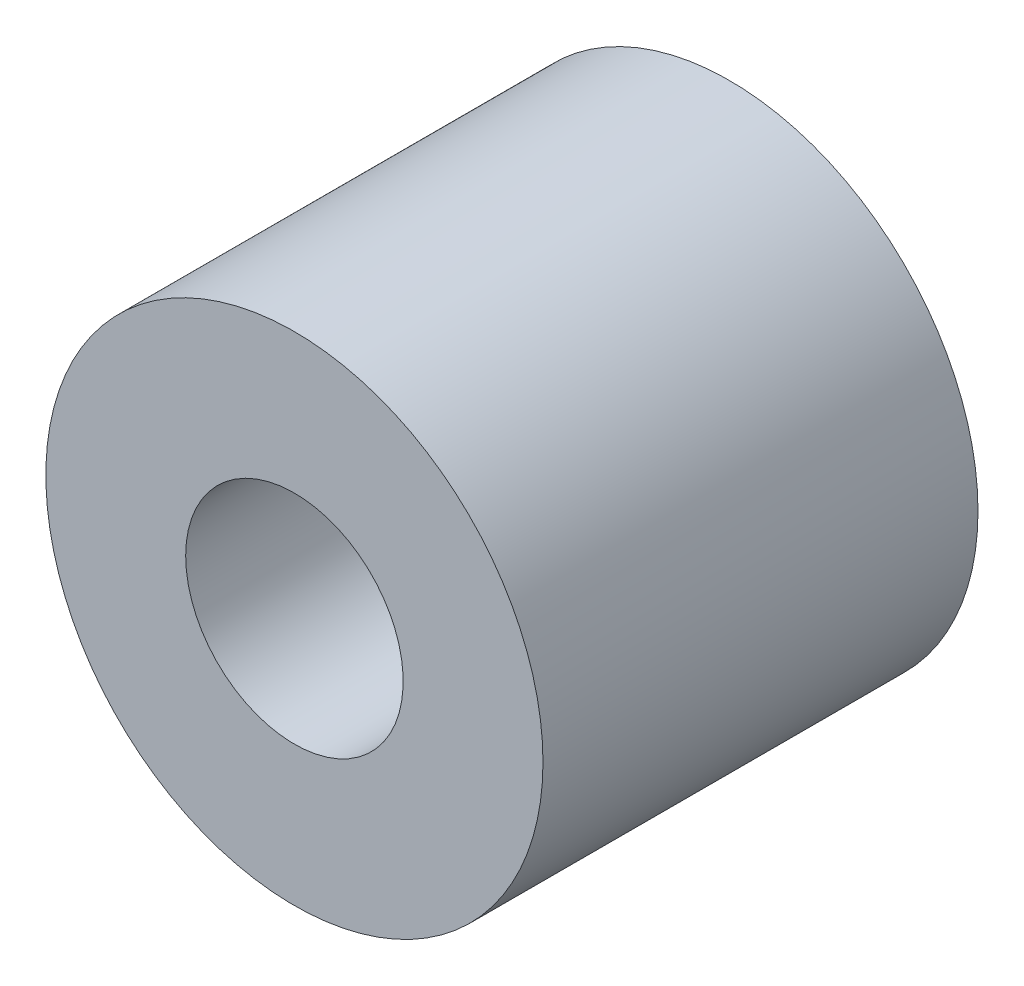
ISO-10303-21;
HEADER;
FILE_DESCRIPTION(('STEP AP214'),'2;1');
FILE_NAME('part.step','',(''),(''),'','','');
FILE_SCHEMA(('AUTOMOTIVE_DESIGN { 1 0 10303 214 1 1 1 1 }'));
ENDSEC;
DATA;
#1=APPLICATION_CONTEXT('core data for automotive mechanical design processes');
#2=APPLICATION_PROTOCOL_DEFINITION('international standard','automotive_design',2000,#1);
#3=PRODUCT_CONTEXT('',#1,'mechanical');
#4=PRODUCT('Part','Part','',(#3));
#5=PRODUCT_RELATED_PRODUCT_CATEGORY('part','',(#4));
#6=PRODUCT_DEFINITION_FORMATION('','',#4);
#7=PRODUCT_DEFINITION_CONTEXT('part definition',#1,'design');
#8=PRODUCT_DEFINITION('design','',#6,#7);
#9=PRODUCT_DEFINITION_SHAPE('','',#8);
#10=(LENGTH_UNIT() NAMED_UNIT(*) SI_UNIT(.MILLI.,.METRE.));
#11=(NAMED_UNIT(*) PLANE_ANGLE_UNIT() SI_UNIT($,.RADIAN.));
#12=(NAMED_UNIT(*) SI_UNIT($,.STERADIAN.) SOLID_ANGLE_UNIT());
#13=UNCERTAINTY_MEASURE_WITH_UNIT(LENGTH_MEASURE(1.E-05),#10,'distance_accuracy_value','');
#14=(GEOMETRIC_REPRESENTATION_CONTEXT(3) GLOBAL_UNCERTAINTY_ASSIGNED_CONTEXT((#13)) GLOBAL_UNIT_ASSIGNED_CONTEXT((#10,
#11,#12)) REPRESENTATION_CONTEXT('',''));
#15=CARTESIAN_POINT('',(0.,0.,0.));
#16=DIRECTION('',(0.,0.,1.));
#17=DIRECTION('',(1.,0.,0.));
#18=AXIS2_PLACEMENT_3D('',#15,#16,#17);
#19=CARTESIAN_POINT('',(0.,0.,7.));
#20=DIRECTION('',(0.,0.,-1.));
#21=DIRECTION('',(-1.,0.,0.));
#22=AXIS2_PLACEMENT_3D('',#19,#20,#21);
#23=CYLINDRICAL_SURFACE('',#22,4.);
#24=CARTESIAN_POINT('',(0.,0.,7.));
#25=DIRECTION('',(0.,0.,1.));
#26=DIRECTION('',(1.,0.,0.));
#27=AXIS2_PLACEMENT_3D('',#24,#25,#26);
#28=CIRCLE('',#27,4.);
#29=CARTESIAN_POINT('',(4.,0.,7.));
#30=VERTEX_POINT('',#29);
#31=EDGE_CURVE('E10',#30,#30,#28,.T.);
#32=ORIENTED_EDGE('',*,*,#31,.F.);
#33=EDGE_LOOP('',(#32));
#34=FACE_BOUND('',#33,.T.);
#35=CARTESIAN_POINT('',(0.,0.,0.));
#36=DIRECTION('',(0.,0.,1.));
#37=DIRECTION('',(1.,0.,0.));
#38=AXIS2_PLACEMENT_3D('',#35,#36,#37);
#39=CIRCLE('',#38,4.);
#40=CARTESIAN_POINT('',(4.,0.,0.));
#41=VERTEX_POINT('',#40);
#42=EDGE_CURVE('E34',#41,#41,#39,.T.);
#43=ORIENTED_EDGE('',*,*,#42,.T.);
#44=EDGE_LOOP('',(#43));
#45=FACE_BOUND('',#44,.T.);
#46=ADVANCED_FACE('F31',(#34,#45),#23,.T.);
#47=CARTESIAN_POINT('',(0.,0.,7.));
#48=DIRECTION('',(0.,0.,1.));
#49=DIRECTION('',(1.,0.,0.));
#50=AXIS2_PLACEMENT_3D('',#47,#48,#49);
#51=PLANE('',#50);
#52=CARTESIAN_POINT('',(0.,0.,7.));
#53=DIRECTION('',(0.,0.,-1.));
#54=DIRECTION('',(-1.,0.,0.));
#55=AXIS2_PLACEMENT_3D('',#52,#53,#54);
#56=CIRCLE('',#55,1.75);
#57=CARTESIAN_POINT('',(-1.75,0.,7.));
#58=VERTEX_POINT('',#57);
#59=EDGE_CURVE('E41',#58,#58,#56,.T.);
#60=ORIENTED_EDGE('',*,*,#59,.T.);
#61=EDGE_LOOP('',(#60));
#62=FACE_BOUND('',#61,.T.);
#63=ORIENTED_EDGE('',*,*,#31,.T.);
#64=EDGE_LOOP('',(#63));
#65=FACE_BOUND('',#64,.T.);
#66=ADVANCED_FACE('F49',(#62,#65),#51,.T.);
#67=CARTESIAN_POINT('',(0.,0.,0.));
#68=DIRECTION('',(0.,0.,1.));
#69=DIRECTION('',(1.,0.,0.));
#70=AXIS2_PLACEMENT_3D('',#67,#68,#69);
#71=PLANE('',#70);
#72=CARTESIAN_POINT('',(0.,0.,0.));
#73=DIRECTION('',(0.,0.,-1.));
#74=DIRECTION('',(-1.,0.,0.));
#75=AXIS2_PLACEMENT_3D('',#72,#73,#74);
#76=CIRCLE('',#75,1.75);
#77=CARTESIAN_POINT('',(-1.75,0.,0.));
#78=VERTEX_POINT('',#77);
#79=EDGE_CURVE('E43',#78,#78,#76,.T.);
#80=ORIENTED_EDGE('',*,*,#79,.F.);
#81=EDGE_LOOP('',(#80));
#82=FACE_BOUND('',#81,.T.);
#83=ORIENTED_EDGE('',*,*,#42,.F.);
#84=EDGE_LOOP('',(#83));
#85=FACE_BOUND('',#84,.T.);
#86=ADVANCED_FACE('F54',(#82,#85),#71,.F.);
#87=CARTESIAN_POINT('',(0.,0.,7.));
#88=DIRECTION('',(0.,0.,-1.));
#89=DIRECTION('',(-1.,0.,0.));
#90=AXIS2_PLACEMENT_3D('',#87,#88,#89);
#91=CYLINDRICAL_SURFACE('',#90,1.75);
#92=ORIENTED_EDGE('',*,*,#59,.F.);
#93=EDGE_LOOP('',(#92));
#94=FACE_BOUND('',#93,.T.);
#95=ORIENTED_EDGE('',*,*,#79,.T.);
#96=EDGE_LOOP('',(#95));
#97=FACE_BOUND('',#96,.T.);
#98=ADVANCED_FACE('F51',(#94,#97),#91,.F.);
#99=CLOSED_SHELL('',(#46,#66,#86,#98));
#100=MANIFOLD_SOLID_BREP('B2',#99);
#101=ADVANCED_BREP_SHAPE_REPRESENTATION('',(#18,#100),#14);
#102=SHAPE_DEFINITION_REPRESENTATION(#9,#101);
ENDSEC;
END-ISO-10303-21;
